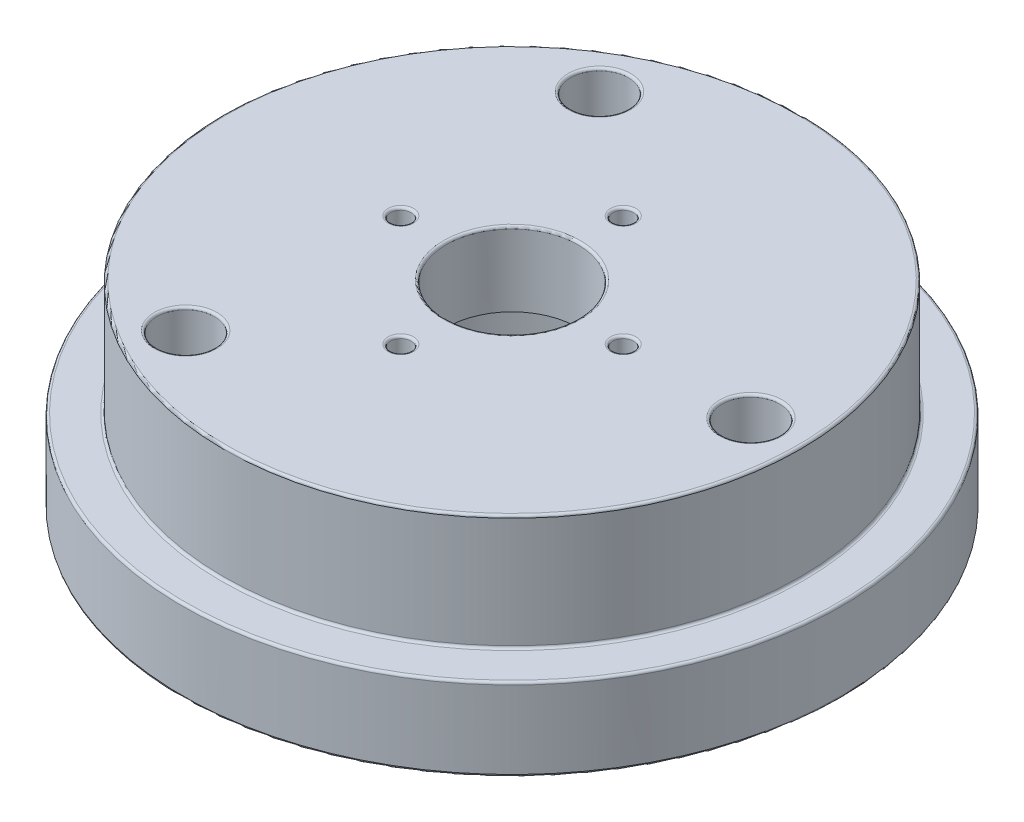
ISO-10303-21;
HEADER;
FILE_DESCRIPTION(('STEP AP214'),'2;1');
FILE_NAME('part.step','',(''),(''),'','','');
FILE_SCHEMA(('AUTOMOTIVE_DESIGN { 1 0 10303 214 1 1 1 1 }'));
ENDSEC;
DATA;
#1=APPLICATION_CONTEXT('core data for automotive mechanical design processes');
#2=APPLICATION_PROTOCOL_DEFINITION('international standard','automotive_design',2000,#1);
#3=PRODUCT_CONTEXT('',#1,'mechanical');
#4=PRODUCT('Part','Part','',(#3));
#5=PRODUCT_RELATED_PRODUCT_CATEGORY('part','',(#4));
#6=PRODUCT_DEFINITION_FORMATION('','',#4);
#7=PRODUCT_DEFINITION_CONTEXT('part definition',#1,'design');
#8=PRODUCT_DEFINITION('design','',#6,#7);
#9=PRODUCT_DEFINITION_SHAPE('','',#8);
#10=(LENGTH_UNIT() NAMED_UNIT(*) SI_UNIT(.MILLI.,.METRE.));
#11=(NAMED_UNIT(*) PLANE_ANGLE_UNIT() SI_UNIT($,.RADIAN.));
#12=(NAMED_UNIT(*) SI_UNIT($,.STERADIAN.) SOLID_ANGLE_UNIT());
#13=UNCERTAINTY_MEASURE_WITH_UNIT(LENGTH_MEASURE(1.E-05),#10,'distance_accuracy_value','');
#14=(GEOMETRIC_REPRESENTATION_CONTEXT(3) GLOBAL_UNCERTAINTY_ASSIGNED_CONTEXT((#13)) GLOBAL_UNIT_ASSIGNED_CONTEXT((#10,
#11,#12)) REPRESENTATION_CONTEXT('',''));
#15=CARTESIAN_POINT('',(0.,0.,0.));
#16=DIRECTION('',(0.,0.,1.));
#17=DIRECTION('',(1.,0.,0.));
#18=AXIS2_PLACEMENT_3D('',#15,#16,#17);
#19=CARTESIAN_POINT('',(-6.75,12.,0.));
#20=DIRECTION('',(0.,-1.,0.));
#21=DIRECTION('',(1.,0.,0.));
#22=AXIS2_PLACEMENT_3D('',#19,#20,#21);
#23=CYLINDRICAL_SURFACE('',#22,0.624999999999999);
#24=CARTESIAN_POINT('',(-6.75,11.85,0.));
#25=DIRECTION('',(0.,1.,0.));
#26=DIRECTION('',(-1.,0.,0.));
#27=AXIS2_PLACEMENT_3D('',#24,#25,#26);
#28=CIRCLE('',#27,0.624999999999999);
#29=CARTESIAN_POINT('',(-7.375,11.85,0.));
#30=VERTEX_POINT('',#29);
#31=EDGE_CURVE('E70',#30,#30,#28,.T.);
#32=ORIENTED_EDGE('',*,*,#31,.T.);
#33=EDGE_LOOP('',(#32));
#34=FACE_BOUND('',#33,.T.);
#35=CARTESIAN_POINT('',(-6.75,7.5,0.));
#36=DIRECTION('',(0.,-1.,0.));
#37=DIRECTION('',(1.,0.,0.));
#38=AXIS2_PLACEMENT_3D('',#35,#36,#37);
#39=CIRCLE('',#38,0.624999999999999);
#40=CARTESIAN_POINT('',(-6.125,7.5,0.));
#41=VERTEX_POINT('',#40);
#42=EDGE_CURVE('E154',#41,#41,#39,.T.);
#43=ORIENTED_EDGE('',*,*,#42,.T.);
#44=EDGE_LOOP('',(#43));
#45=FACE_BOUND('',#44,.T.);
#46=ADVANCED_FACE('F35',(#34,#45),#23,.F.);
#47=CARTESIAN_POINT('',(0.,12.,6.75));
#48=DIRECTION('',(0.,-1.,0.));
#49=DIRECTION('',(1.,0.,0.));
#50=AXIS2_PLACEMENT_3D('',#47,#48,#49);
#51=CYLINDRICAL_SURFACE('',#50,0.624999999999999);
#52=CARTESIAN_POINT('',(0.,11.85,6.75));
#53=DIRECTION('',(0.,1.,0.));
#54=DIRECTION('',(-1.,0.,0.));
#55=AXIS2_PLACEMENT_3D('',#52,#53,#54);
#56=CIRCLE('',#55,0.624999999999999);
#57=CARTESIAN_POINT('',(-0.624999999999929,11.85,6.75));
#58=VERTEX_POINT('',#57);
#59=EDGE_CURVE('E67',#58,#58,#56,.T.);
#60=ORIENTED_EDGE('',*,*,#59,.T.);
#61=EDGE_LOOP('',(#60));
#62=FACE_BOUND('',#61,.T.);
#63=CARTESIAN_POINT('',(0.,7.5,6.75));
#64=DIRECTION('',(0.,-1.,0.));
#65=DIRECTION('',(1.,0.,0.));
#66=AXIS2_PLACEMENT_3D('',#63,#64,#65);
#67=CIRCLE('',#66,0.624999999999999);
#68=CARTESIAN_POINT('',(0.62500000000007,7.5,6.75));
#69=VERTEX_POINT('',#68);
#70=EDGE_CURVE('E157',#69,#69,#67,.T.);
#71=ORIENTED_EDGE('',*,*,#70,.T.);
#72=EDGE_LOOP('',(#71));
#73=FACE_BOUND('',#72,.T.);
#74=ADVANCED_FACE('F161',(#62,#73),#51,.F.);
#75=CARTESIAN_POINT('',(0.,12.,0.));
#76=DIRECTION('',(0.,-1.,0.));
#77=DIRECTION('',(1.,0.,0.));
#78=AXIS2_PLACEMENT_3D('',#75,#76,#77);
#79=CYLINDRICAL_SURFACE('',#78,4.);
#80=CARTESIAN_POINT('',(0.,11.85,0.));
#81=DIRECTION('',(0.,1.,0.));
#82=DIRECTION('',(-1.,0.,0.));
#83=AXIS2_PLACEMENT_3D('',#80,#81,#82);
#84=CIRCLE('',#83,4.);
#85=CARTESIAN_POINT('',(-4.,11.85,0.));
#86=VERTEX_POINT('',#85);
#87=EDGE_CURVE('E61',#86,#86,#84,.T.);
#88=ORIENTED_EDGE('',*,*,#87,.T.);
#89=EDGE_LOOP('',(#88));
#90=FACE_BOUND('',#89,.T.);
#91=CARTESIAN_POINT('',(0.,7.5,0.));
#92=DIRECTION('',(0.,-1.,0.));
#93=DIRECTION('',(1.,0.,0.));
#94=AXIS2_PLACEMENT_3D('',#91,#92,#93);
#95=CIRCLE('',#94,4.);
#96=CARTESIAN_POINT('',(4.,7.5,0.));
#97=VERTEX_POINT('',#96);
#98=EDGE_CURVE('E145',#97,#97,#95,.T.);
#99=ORIENTED_EDGE('',*,*,#98,.T.);
#100=EDGE_LOOP('',(#99));
#101=FACE_BOUND('',#100,.T.);
#102=ADVANCED_FACE('F177',(#90,#101),#79,.F.);
#103=CARTESIAN_POINT('',(6.75,12.,0.));
#104=DIRECTION('',(0.,-1.,0.));
#105=DIRECTION('',(1.,0.,0.));
#106=AXIS2_PLACEMENT_3D('',#103,#104,#105);
#107=CYLINDRICAL_SURFACE('',#106,0.625);
#108=CARTESIAN_POINT('',(6.75,11.85,0.));
#109=DIRECTION('',(0.,1.,0.));
#110=DIRECTION('',(-1.,0.,0.));
#111=AXIS2_PLACEMENT_3D('',#108,#109,#110);
#112=CIRCLE('',#111,0.625);
#113=CARTESIAN_POINT('',(6.125,11.85,0.));
#114=VERTEX_POINT('',#113);
#115=EDGE_CURVE('E58',#114,#114,#112,.T.);
#116=ORIENTED_EDGE('',*,*,#115,.T.);
#117=EDGE_LOOP('',(#116));
#118=FACE_BOUND('',#117,.T.);
#119=CARTESIAN_POINT('',(6.75,7.5,0.));
#120=DIRECTION('',(0.,-1.,0.));
#121=DIRECTION('',(1.,0.,0.));
#122=AXIS2_PLACEMENT_3D('',#119,#120,#121);
#123=CIRCLE('',#122,0.625);
#124=CARTESIAN_POINT('',(7.375,7.5,0.));
#125=VERTEX_POINT('',#124);
#126=EDGE_CURVE('E148',#125,#125,#123,.T.);
#127=ORIENTED_EDGE('',*,*,#126,.T.);
#128=EDGE_LOOP('',(#127));
#129=FACE_BOUND('',#128,.T.);
#130=ADVANCED_FACE('F179',(#118,#129),#107,.F.);
#131=CARTESIAN_POINT('',(0.,12.,-6.75));
#132=DIRECTION('',(0.,-1.,0.));
#133=DIRECTION('',(1.,0.,0.));
#134=AXIS2_PLACEMENT_3D('',#131,#132,#133);
#135=CYLINDRICAL_SURFACE('',#134,0.625);
#136=CARTESIAN_POINT('',(0.,11.85,-6.75));
#137=DIRECTION('',(0.,1.,0.));
#138=DIRECTION('',(-1.,0.,0.));
#139=AXIS2_PLACEMENT_3D('',#136,#137,#138);
#140=CIRCLE('',#139,0.625);
#141=CARTESIAN_POINT('',(-0.625000000000023,11.85,-6.75));
#142=VERTEX_POINT('',#141);
#143=EDGE_CURVE('E55',#142,#142,#140,.T.);
#144=ORIENTED_EDGE('',*,*,#143,.T.);
#145=EDGE_LOOP('',(#144));
#146=FACE_BOUND('',#145,.T.);
#147=CARTESIAN_POINT('',(0.,7.5,-6.75));
#148=DIRECTION('',(0.,-1.,0.));
#149=DIRECTION('',(1.,0.,0.));
#150=AXIS2_PLACEMENT_3D('',#147,#148,#149);
#151=CIRCLE('',#150,0.625);
#152=CARTESIAN_POINT('',(0.624999999999976,7.5,-6.75));
#153=VERTEX_POINT('',#152);
#154=EDGE_CURVE('E151',#153,#153,#151,.T.);
#155=ORIENTED_EDGE('',*,*,#154,.T.);
#156=EDGE_LOOP('',(#155));
#157=FACE_BOUND('',#156,.T.);
#158=ADVANCED_FACE('F186',(#146,#157),#135,.F.);
#159=CARTESIAN_POINT('',(0.,0.,0.));
#160=DIRECTION('',(0.,-1.,0.));
#161=DIRECTION('',(1.,0.,0.));
#162=AXIS2_PLACEMENT_3D('',#159,#160,#161);
#163=PLANE('',#162);
#164=CARTESIAN_POINT('',(0.,0.,0.));
#165=DIRECTION('',(0.,-1.,0.));
#166=DIRECTION('',(1.,0.,0.));
#167=AXIS2_PLACEMENT_3D('',#164,#165,#166);
#168=CIRCLE('',#167,19.85);
#169=CARTESIAN_POINT('',(19.85,0.,0.));
#170=VERTEX_POINT('',#169);
#171=EDGE_CURVE('E109',#170,#170,#168,.T.);
#172=ORIENTED_EDGE('',*,*,#171,.T.);
#173=EDGE_LOOP('',(#172));
#174=FACE_BOUND('',#173,.T.);
#175=CARTESIAN_POINT('',(14.5,0.,0.));
#176=DIRECTION('',(0.,-1.,0.));
#177=DIRECTION('',(1.,0.,0.));
#178=AXIS2_PLACEMENT_3D('',#175,#176,#177);
#179=CIRCLE('',#178,1.9);
#180=CARTESIAN_POINT('',(16.4,0.,0.));
#181=VERTEX_POINT('',#180);
#182=EDGE_CURVE('E112',#181,#181,#179,.F.);
#183=ORIENTED_EDGE('',*,*,#182,.T.);
#184=EDGE_LOOP('',(#183));
#185=FACE_BOUND('',#184,.T.);
#186=CARTESIAN_POINT('',(-7.24999999999999,0.,-12.5573683548744));
#187=DIRECTION('',(0.,-1.,0.));
#188=DIRECTION('',(1.,0.,0.));
#189=AXIS2_PLACEMENT_3D('',#186,#187,#188);
#190=CIRCLE('',#189,1.89999999999998);
#191=CARTESIAN_POINT('',(-5.35000000000002,0.,-12.5573683548744));
#192=VERTEX_POINT('',#191);
#193=EDGE_CURVE('E115',#192,#192,#190,.F.);
#194=ORIENTED_EDGE('',*,*,#193,.T.);
#195=EDGE_LOOP('',(#194));
#196=FACE_BOUND('',#195,.T.);
#197=CARTESIAN_POINT('',(-7.25,0.,12.5573683548744));
#198=DIRECTION('',(0.,-1.,0.));
#199=DIRECTION('',(1.,0.,0.));
#200=AXIS2_PLACEMENT_3D('',#197,#198,#199);
#201=CIRCLE('',#200,1.89999999999996);
#202=CARTESIAN_POINT('',(-5.35000000000004,0.,12.5573683548744));
#203=VERTEX_POINT('',#202);
#204=EDGE_CURVE('E118',#203,#203,#201,.F.);
#205=ORIENTED_EDGE('',*,*,#204,.T.);
#206=EDGE_LOOP('',(#205));
#207=FACE_BOUND('',#206,.T.);
#208=CARTESIAN_POINT('',(0.,0.,0.));
#209=DIRECTION('',(0.,-1.,0.));
#210=DIRECTION('',(1.,0.,0.));
#211=AXIS2_PLACEMENT_3D('',#208,#209,#210);
#212=CIRCLE('',#211,10.15);
#213=CARTESIAN_POINT('',(10.15,0.,0.));
#214=VERTEX_POINT('',#213);
#215=EDGE_CURVE('E121',#214,#214,#212,.F.);
#216=ORIENTED_EDGE('',*,*,#215,.T.);
#217=EDGE_LOOP('',(#216));
#218=FACE_BOUND('',#217,.T.);
#219=ADVANCED_FACE('F216',(#174,#185,#196,#207,#218),#163,.T.);
#220=CARTESIAN_POINT('',(0.,12.,0.));
#221=DIRECTION('',(0.,1.,0.));
#222=DIRECTION('',(-1.,0.,0.));
#223=AXIS2_PLACEMENT_3D('',#220,#221,#222);
#224=CYLINDRICAL_SURFACE('',#223,20.);
#225=CARTESIAN_POINT('',(0.,4.85,0.));
#226=DIRECTION('',(0.,1.,0.));
#227=DIRECTION('',(-1.,0.,0.));
#228=AXIS2_PLACEMENT_3D('',#225,#226,#227);
#229=CIRCLE('',#228,20.);
#230=CARTESIAN_POINT('',(-20.,4.85,0.));
#231=VERTEX_POINT('',#230);
#232=EDGE_CURVE('E124',#231,#231,#229,.F.);
#233=ORIENTED_EDGE('',*,*,#232,.T.);
#234=EDGE_LOOP('',(#233));
#235=FACE_BOUND('',#234,.T.);
#236=CARTESIAN_POINT('',(0.,0.149999999999999,0.));
#237=DIRECTION('',(0.,-1.,0.));
#238=DIRECTION('',(1.,0.,0.));
#239=AXIS2_PLACEMENT_3D('',#236,#237,#238);
#240=CIRCLE('',#239,20.);
#241=CARTESIAN_POINT('',(20.,0.149999999999999,0.));
#242=VERTEX_POINT('',#241);
#243=EDGE_CURVE('E127',#242,#242,#240,.F.);
#244=ORIENTED_EDGE('',*,*,#243,.T.);
#245=EDGE_LOOP('',(#244));
#246=FACE_BOUND('',#245,.T.);
#247=ADVANCED_FACE('F212',(#235,#246),#224,.T.);
#248=CARTESIAN_POINT('',(-20.,5.,0.));
#249=DIRECTION('',(0.,1.,0.));
#250=DIRECTION('',(-1.,0.,0.));
#251=AXIS2_PLACEMENT_3D('',#248,#249,#250);
#252=PLANE('',#251);
#253=CARTESIAN_POINT('',(0.,5.,0.));
#254=DIRECTION('',(0.,1.,0.));
#255=DIRECTION('',(-1.,0.,0.));
#256=AXIS2_PLACEMENT_3D('',#253,#254,#255);
#257=CIRCLE('',#256,19.85);
#258=CARTESIAN_POINT('',(-19.85,5.,0.));
#259=VERTEX_POINT('',#258);
#260=EDGE_CURVE('E130',#259,#259,#257,.T.);
#261=ORIENTED_EDGE('',*,*,#260,.T.);
#262=EDGE_LOOP('',(#261));
#263=FACE_BOUND('',#262,.T.);
#264=CARTESIAN_POINT('',(0.,5.,0.));
#265=DIRECTION('',(0.,1.,0.));
#266=DIRECTION('',(-1.,0.,0.));
#267=AXIS2_PLACEMENT_3D('',#264,#265,#266);
#268=CIRCLE('',#267,17.65);
#269=CARTESIAN_POINT('',(-17.65,5.,0.));
#270=VERTEX_POINT('',#269);
#271=EDGE_CURVE('E133',#270,#270,#268,.F.);
#272=ORIENTED_EDGE('',*,*,#271,.T.);
#273=EDGE_LOOP('',(#272));
#274=FACE_BOUND('',#273,.T.);
#275=ADVANCED_FACE('F208',(#263,#274),#252,.T.);
#276=CARTESIAN_POINT('',(0.,12.,0.));
#277=DIRECTION('',(0.,1.,0.));
#278=DIRECTION('',(-1.,0.,0.));
#279=AXIS2_PLACEMENT_3D('',#276,#277,#278);
#280=CYLINDRICAL_SURFACE('',#279,17.5);
#281=CARTESIAN_POINT('',(0.,11.85,0.));
#282=DIRECTION('',(0.,1.,0.));
#283=DIRECTION('',(-1.,0.,0.));
#284=AXIS2_PLACEMENT_3D('',#281,#282,#283);
#285=CIRCLE('',#284,17.5);
#286=CARTESIAN_POINT('',(-17.5,11.85,0.));
#287=VERTEX_POINT('',#286);
#288=EDGE_CURVE('E136',#287,#287,#285,.F.);
#289=ORIENTED_EDGE('',*,*,#288,.T.);
#290=EDGE_LOOP('',(#289));
#291=FACE_BOUND('',#290,.T.);
#292=CARTESIAN_POINT('',(0.,5.15,0.));
#293=DIRECTION('',(0.,1.,0.));
#294=DIRECTION('',(-1.,0.,0.));
#295=AXIS2_PLACEMENT_3D('',#292,#293,#294);
#296=CIRCLE('',#295,17.5);
#297=CARTESIAN_POINT('',(-17.5,5.15,0.));
#298=VERTEX_POINT('',#297);
#299=EDGE_CURVE('E139',#298,#298,#296,.T.);
#300=ORIENTED_EDGE('',*,*,#299,.T.);
#301=EDGE_LOOP('',(#300));
#302=FACE_BOUND('',#301,.T.);
#303=ADVANCED_FACE('F204',(#291,#302),#280,.T.);
#304=CARTESIAN_POINT('',(-17.5,12.,0.));
#305=DIRECTION('',(0.,1.,0.));
#306=DIRECTION('',(-1.,0.,0.));
#307=AXIS2_PLACEMENT_3D('',#304,#305,#306);
#308=PLANE('',#307);
#309=CARTESIAN_POINT('',(-6.75,12.,0.));
#310=DIRECTION('',(0.,1.,0.));
#311=DIRECTION('',(-1.,0.,0.));
#312=AXIS2_PLACEMENT_3D('',#309,#310,#311);
#313=CIRCLE('',#312,0.774999999999999);
#314=CARTESIAN_POINT('',(-7.525,12.,0.));
#315=VERTEX_POINT('',#314);
#316=EDGE_CURVE('E73',#315,#315,#313,.F.);
#317=ORIENTED_EDGE('',*,*,#316,.T.);
#318=EDGE_LOOP('',(#317));
#319=FACE_BOUND('',#318,.T.);
#320=CARTESIAN_POINT('',(0.,12.,6.75));
#321=DIRECTION('',(0.,1.,0.));
#322=DIRECTION('',(-1.,0.,0.));
#323=AXIS2_PLACEMENT_3D('',#320,#321,#322);
#324=CIRCLE('',#323,0.774999999999999);
#325=CARTESIAN_POINT('',(-0.774999999999929,12.,6.75));
#326=VERTEX_POINT('',#325);
#327=EDGE_CURVE('E76',#326,#326,#324,.F.);
#328=ORIENTED_EDGE('',*,*,#327,.T.);
#329=EDGE_LOOP('',(#328));
#330=FACE_BOUND('',#329,.T.);
#331=CARTESIAN_POINT('',(14.5,12.,0.));
#332=DIRECTION('',(0.,1.,0.));
#333=DIRECTION('',(-1.,0.,0.));
#334=AXIS2_PLACEMENT_3D('',#331,#332,#333);
#335=CIRCLE('',#334,1.9);
#336=CARTESIAN_POINT('',(12.6,12.,0.));
#337=VERTEX_POINT('',#336);
#338=EDGE_CURVE('E79',#337,#337,#335,.F.);
#339=ORIENTED_EDGE('',*,*,#338,.T.);
#340=EDGE_LOOP('',(#339));
#341=FACE_BOUND('',#340,.T.);
#342=CARTESIAN_POINT('',(0.,12.,0.));
#343=DIRECTION('',(0.,1.,0.));
#344=DIRECTION('',(-1.,0.,0.));
#345=AXIS2_PLACEMENT_3D('',#342,#343,#344);
#346=CIRCLE('',#345,4.15);
#347=CARTESIAN_POINT('',(-4.15,12.,0.));
#348=VERTEX_POINT('',#347);
#349=EDGE_CURVE('E82',#348,#348,#346,.F.);
#350=ORIENTED_EDGE('',*,*,#349,.T.);
#351=EDGE_LOOP('',(#350));
#352=FACE_BOUND('',#351,.T.);
#353=CARTESIAN_POINT('',(6.75,12.,0.));
#354=DIRECTION('',(0.,1.,0.));
#355=DIRECTION('',(-1.,0.,0.));
#356=AXIS2_PLACEMENT_3D('',#353,#354,#355);
#357=CIRCLE('',#356,0.775);
#358=CARTESIAN_POINT('',(5.975,12.,0.));
#359=VERTEX_POINT('',#358);
#360=EDGE_CURVE('E85',#359,#359,#357,.F.);
#361=ORIENTED_EDGE('',*,*,#360,.T.);
#362=EDGE_LOOP('',(#361));
#363=FACE_BOUND('',#362,.T.);
#364=CARTESIAN_POINT('',(0.,12.,-6.75));
#365=DIRECTION('',(0.,1.,0.));
#366=DIRECTION('',(-1.,0.,0.));
#367=AXIS2_PLACEMENT_3D('',#364,#365,#366);
#368=CIRCLE('',#367,0.775);
#369=CARTESIAN_POINT('',(-0.775000000000023,12.,-6.75));
#370=VERTEX_POINT('',#369);
#371=EDGE_CURVE('E88',#370,#370,#368,.F.);
#372=ORIENTED_EDGE('',*,*,#371,.T.);
#373=EDGE_LOOP('',(#372));
#374=FACE_BOUND('',#373,.T.);
#375=CARTESIAN_POINT('',(-7.24999999999999,12.,-12.5573683548744));
#376=DIRECTION('',(0.,1.,0.));
#377=DIRECTION('',(-1.,0.,0.));
#378=AXIS2_PLACEMENT_3D('',#375,#376,#377);
#379=CIRCLE('',#378,1.89999999999998);
#380=CARTESIAN_POINT('',(-9.14999999999997,12.,-12.5573683548744));
#381=VERTEX_POINT('',#380);
#382=EDGE_CURVE('E91',#381,#381,#379,.F.);
#383=ORIENTED_EDGE('',*,*,#382,.T.);
#384=EDGE_LOOP('',(#383));
#385=FACE_BOUND('',#384,.T.);
#386=CARTESIAN_POINT('',(-7.25,12.,12.5573683548744));
#387=DIRECTION('',(0.,1.,0.));
#388=DIRECTION('',(-1.,0.,0.));
#389=AXIS2_PLACEMENT_3D('',#386,#387,#388);
#390=CIRCLE('',#389,1.89999999999996);
#391=CARTESIAN_POINT('',(-9.14999999999996,12.,12.5573683548744));
#392=VERTEX_POINT('',#391);
#393=EDGE_CURVE('E94',#392,#392,#390,.F.);
#394=ORIENTED_EDGE('',*,*,#393,.T.);
#395=EDGE_LOOP('',(#394));
#396=FACE_BOUND('',#395,.T.);
#397=CARTESIAN_POINT('',(0.,12.,0.));
#398=DIRECTION('',(0.,1.,0.));
#399=DIRECTION('',(-1.,0.,0.));
#400=AXIS2_PLACEMENT_3D('',#397,#398,#399);
#401=CIRCLE('',#400,17.35);
#402=CARTESIAN_POINT('',(-17.35,12.,0.));
#403=VERTEX_POINT('',#402);
#404=EDGE_CURVE('E142',#403,#403,#401,.T.);
#405=ORIENTED_EDGE('',*,*,#404,.T.);
#406=EDGE_LOOP('',(#405));
#407=FACE_BOUND('',#406,.T.);
#408=ADVANCED_FACE('F200',(#319,#330,#341,#352,#363,#374,#385,#396,#407),#308,.T.);
#409=CARTESIAN_POINT('',(14.5,12.,0.));
#410=DIRECTION('',(0.,-1.,0.));
#411=DIRECTION('',(1.,0.,0.));
#412=AXIS2_PLACEMENT_3D('',#409,#410,#411);
#413=CYLINDRICAL_SURFACE('',#412,1.75);
#414=CARTESIAN_POINT('',(14.5,11.85,0.));
#415=DIRECTION('',(0.,1.,0.));
#416=DIRECTION('',(-1.,0.,0.));
#417=AXIS2_PLACEMENT_3D('',#414,#415,#416);
#418=CIRCLE('',#417,1.75);
#419=CARTESIAN_POINT('',(12.75,11.85,0.));
#420=VERTEX_POINT('',#419);
#421=EDGE_CURVE('E64',#420,#420,#418,.T.);
#422=ORIENTED_EDGE('',*,*,#421,.T.);
#423=EDGE_LOOP('',(#422));
#424=FACE_BOUND('',#423,.T.);
#425=CARTESIAN_POINT('',(14.5,0.149999999999999,0.));
#426=DIRECTION('',(0.,-1.,0.));
#427=DIRECTION('',(1.,0.,0.));
#428=AXIS2_PLACEMENT_3D('',#425,#426,#427);
#429=CIRCLE('',#428,1.75);
#430=CARTESIAN_POINT('',(16.25,0.149999999999999,0.));
#431=VERTEX_POINT('',#430);
#432=EDGE_CURVE('E106',#431,#431,#429,.T.);
#433=ORIENTED_EDGE('',*,*,#432,.T.);
#434=EDGE_LOOP('',(#433));
#435=FACE_BOUND('',#434,.T.);
#436=ADVANCED_FACE('F203',(#424,#435),#413,.F.);
#437=CARTESIAN_POINT('',(-7.24999999999999,12.,-12.5573683548744));
#438=DIRECTION('',(0.,-1.,0.));
#439=DIRECTION('',(1.,0.,0.));
#440=AXIS2_PLACEMENT_3D('',#437,#438,#439);
#441=CYLINDRICAL_SURFACE('',#440,1.74999999999998);
#442=CARTESIAN_POINT('',(-7.24999999999999,11.85,-12.5573683548744));
#443=DIRECTION('',(0.,1.,0.));
#444=DIRECTION('',(-1.,0.,0.));
#445=AXIS2_PLACEMENT_3D('',#442,#443,#444);
#446=CIRCLE('',#445,1.74999999999998);
#447=CARTESIAN_POINT('',(-8.99999999999997,11.85,-12.5573683548744));
#448=VERTEX_POINT('',#447);
#449=EDGE_CURVE('E50',#448,#448,#446,.T.);
#450=ORIENTED_EDGE('',*,*,#449,.T.);
#451=EDGE_LOOP('',(#450));
#452=FACE_BOUND('',#451,.T.);
#453=CARTESIAN_POINT('',(-7.24999999999999,0.149999999999999,-12.5573683548744));
#454=DIRECTION('',(0.,-1.,0.));
#455=DIRECTION('',(1.,0.,0.));
#456=AXIS2_PLACEMENT_3D('',#453,#454,#455);
#457=CIRCLE('',#456,1.74999999999998);
#458=CARTESIAN_POINT('',(-5.50000000000002,0.149999999999999,-12.5573683548744));
#459=VERTEX_POINT('',#458);
#460=EDGE_CURVE('E103',#459,#459,#457,.T.);
#461=ORIENTED_EDGE('',*,*,#460,.T.);
#462=EDGE_LOOP('',(#461));
#463=FACE_BOUND('',#462,.T.);
#464=ADVANCED_FACE('F297',(#452,#463),#441,.F.);
#465=CARTESIAN_POINT('',(-7.25,12.,12.5573683548744));
#466=DIRECTION('',(0.,-1.,0.));
#467=DIRECTION('',(1.,0.,0.));
#468=AXIS2_PLACEMENT_3D('',#465,#466,#467);
#469=CYLINDRICAL_SURFACE('',#468,1.74999999999996);
#470=CARTESIAN_POINT('',(-7.25,11.85,12.5573683548744));
#471=DIRECTION('',(0.,1.,0.));
#472=DIRECTION('',(-1.,0.,0.));
#473=AXIS2_PLACEMENT_3D('',#470,#471,#472);
#474=CIRCLE('',#473,1.74999999999996);
#475=CARTESIAN_POINT('',(-8.99999999999996,11.85,12.5573683548744));
#476=VERTEX_POINT('',#475);
#477=EDGE_CURVE('E46',#476,#476,#474,.T.);
#478=ORIENTED_EDGE('',*,*,#477,.T.);
#479=EDGE_LOOP('',(#478));
#480=FACE_BOUND('',#479,.T.);
#481=CARTESIAN_POINT('',(-7.25,0.149999999999999,12.5573683548744));
#482=DIRECTION('',(0.,-1.,0.));
#483=DIRECTION('',(1.,0.,0.));
#484=AXIS2_PLACEMENT_3D('',#481,#482,#483);
#485=CIRCLE('',#484,1.74999999999996);
#486=CARTESIAN_POINT('',(-5.50000000000004,0.149999999999999,12.5573683548744));
#487=VERTEX_POINT('',#486);
#488=EDGE_CURVE('E100',#487,#487,#485,.T.);
#489=ORIENTED_EDGE('',*,*,#488,.T.);
#490=EDGE_LOOP('',(#489));
#491=FACE_BOUND('',#490,.T.);
#492=ADVANCED_FACE('F294',(#480,#491),#469,.F.);
#493=CARTESIAN_POINT('',(0.,7.5,0.));
#494=DIRECTION('',(0.,-1.,0.));
#495=DIRECTION('',(1.,0.,0.));
#496=AXIS2_PLACEMENT_3D('',#493,#494,#495);
#497=CYLINDRICAL_SURFACE('',#496,10.);
#498=CARTESIAN_POINT('',(0.,7.35,0.));
#499=DIRECTION('',(0.,-1.,0.));
#500=DIRECTION('',(1.,0.,0.));
#501=AXIS2_PLACEMENT_3D('',#498,#499,#500);
#502=CIRCLE('',#501,10.);
#503=CARTESIAN_POINT('',(10.,7.35,0.));
#504=VERTEX_POINT('',#503);
#505=EDGE_CURVE('E10',#504,#504,#502,.F.);
#506=ORIENTED_EDGE('',*,*,#505,.T.);
#507=EDGE_LOOP('',(#506));
#508=FACE_BOUND('',#507,.T.);
#509=CARTESIAN_POINT('',(0.,0.15,0.));
#510=DIRECTION('',(0.,-1.,0.));
#511=DIRECTION('',(1.,0.,0.));
#512=AXIS2_PLACEMENT_3D('',#509,#510,#511);
#513=CIRCLE('',#512,10.);
#514=CARTESIAN_POINT('',(10.,0.15,0.));
#515=VERTEX_POINT('',#514);
#516=EDGE_CURVE('E97',#515,#515,#513,.T.);
#517=ORIENTED_EDGE('',*,*,#516,.T.);
#518=EDGE_LOOP('',(#517));
#519=FACE_BOUND('',#518,.T.);
#520=ADVANCED_FACE('F167',(#508,#519),#497,.F.);
#521=CARTESIAN_POINT('',(0.,7.5,0.));
#522=DIRECTION('',(0.,-1.,0.));
#523=DIRECTION('',(1.,0.,0.));
#524=AXIS2_PLACEMENT_3D('',#521,#522,#523);
#525=PLANE('',#524);
#526=CARTESIAN_POINT('',(0.,7.5,0.));
#527=DIRECTION('',(0.,-1.,0.));
#528=DIRECTION('',(1.,0.,0.));
#529=AXIS2_PLACEMENT_3D('',#526,#527,#528);
#530=CIRCLE('',#529,9.85);
#531=CARTESIAN_POINT('',(9.85,7.5,0.));
#532=VERTEX_POINT('',#531);
#533=EDGE_CURVE('E42',#532,#532,#530,.T.);
#534=ORIENTED_EDGE('',*,*,#533,.T.);
#535=EDGE_LOOP('',(#534));
#536=FACE_BOUND('',#535,.T.);
#537=ORIENTED_EDGE('',*,*,#70,.F.);
#538=EDGE_LOOP('',(#537));
#539=FACE_BOUND('',#538,.T.);
#540=ORIENTED_EDGE('',*,*,#42,.F.);
#541=EDGE_LOOP('',(#540));
#542=FACE_BOUND('',#541,.T.);
#543=ORIENTED_EDGE('',*,*,#154,.F.);
#544=EDGE_LOOP('',(#543));
#545=FACE_BOUND('',#544,.T.);
#546=ORIENTED_EDGE('',*,*,#126,.F.);
#547=EDGE_LOOP('',(#546));
#548=FACE_BOUND('',#547,.T.);
#549=ORIENTED_EDGE('',*,*,#98,.F.);
#550=EDGE_LOOP('',(#549));
#551=FACE_BOUND('',#550,.T.);
#552=ADVANCED_FACE('F163',(#536,#539,#542,#545,#548,#551),#525,.T.);
#553=CARTESIAN_POINT('',(0.,11.85,0.));
#554=DIRECTION('',(0.,1.,0.));
#555=DIRECTION('',(-1.,0.,0.));
#556=AXIS2_PLACEMENT_3D('',#553,#554,#555);
#557=TOROIDAL_SURFACE('',#556,17.35,0.15);
#558=ORIENTED_EDGE('',*,*,#288,.F.);
#559=EDGE_LOOP('',(#558));
#560=FACE_BOUND('',#559,.T.);
#561=ORIENTED_EDGE('',*,*,#404,.F.);
#562=EDGE_LOOP('',(#561));
#563=FACE_BOUND('',#562,.T.);
#564=ADVANCED_FACE('F166',(#560,#563),#557,.T.);
#565=CARTESIAN_POINT('',(0.,4.85,0.));
#566=DIRECTION('',(0.,1.,0.));
#567=DIRECTION('',(-1.,0.,0.));
#568=AXIS2_PLACEMENT_3D('',#565,#566,#567);
#569=TOROIDAL_SURFACE('',#568,19.85,0.15);
#570=ORIENTED_EDGE('',*,*,#232,.F.);
#571=EDGE_LOOP('',(#570));
#572=FACE_BOUND('',#571,.T.);
#573=ORIENTED_EDGE('',*,*,#260,.F.);
#574=EDGE_LOOP('',(#573));
#575=FACE_BOUND('',#574,.T.);
#576=ADVANCED_FACE('F223',(#572,#575),#569,.T.);
#577=CARTESIAN_POINT('',(0.,5.15,0.));
#578=DIRECTION('',(0.,1.,0.));
#579=DIRECTION('',(-1.,0.,0.));
#580=AXIS2_PLACEMENT_3D('',#577,#578,#579);
#581=TOROIDAL_SURFACE('',#580,17.65,0.15);
#582=ORIENTED_EDGE('',*,*,#271,.F.);
#583=EDGE_LOOP('',(#582));
#584=FACE_BOUND('',#583,.T.);
#585=ORIENTED_EDGE('',*,*,#299,.F.);
#586=EDGE_LOOP('',(#585));
#587=FACE_BOUND('',#586,.T.);
#588=ADVANCED_FACE('F227',(#584,#587),#581,.F.);
#589=CARTESIAN_POINT('',(0.,0.149999999999999,0.));
#590=DIRECTION('',(0.,-1.,0.));
#591=DIRECTION('',(1.,0.,0.));
#592=AXIS2_PLACEMENT_3D('',#589,#590,#591);
#593=TOROIDAL_SURFACE('',#592,19.85,0.15);
#594=ORIENTED_EDGE('',*,*,#171,.F.);
#595=EDGE_LOOP('',(#594));
#596=FACE_BOUND('',#595,.T.);
#597=ORIENTED_EDGE('',*,*,#243,.F.);
#598=EDGE_LOOP('',(#597));
#599=FACE_BOUND('',#598,.T.);
#600=ADVANCED_FACE('F231',(#596,#599),#593,.T.);
#601=CARTESIAN_POINT('',(14.5,0.149999999999999,0.));
#602=DIRECTION('',(0.,-1.,0.));
#603=DIRECTION('',(1.,0.,0.));
#604=AXIS2_PLACEMENT_3D('',#601,#602,#603);
#605=TOROIDAL_SURFACE('',#604,1.9,0.15);
#606=ORIENTED_EDGE('',*,*,#182,.F.);
#607=EDGE_LOOP('',(#606));
#608=FACE_BOUND('',#607,.T.);
#609=ORIENTED_EDGE('',*,*,#432,.F.);
#610=EDGE_LOOP('',(#609));
#611=FACE_BOUND('',#610,.T.);
#612=ADVANCED_FACE('F235',(#608,#611),#605,.T.);
#613=CARTESIAN_POINT('',(-7.24999999999999,0.149999999999999,-12.5573683548744));
#614=DIRECTION('',(0.,-1.,0.));
#615=DIRECTION('',(1.,0.,0.));
#616=AXIS2_PLACEMENT_3D('',#613,#614,#615);
#617=TOROIDAL_SURFACE('',#616,1.89999999999998,0.15);
#618=ORIENTED_EDGE('',*,*,#193,.F.);
#619=EDGE_LOOP('',(#618));
#620=FACE_BOUND('',#619,.T.);
#621=ORIENTED_EDGE('',*,*,#460,.F.);
#622=EDGE_LOOP('',(#621));
#623=FACE_BOUND('',#622,.T.);
#624=ADVANCED_FACE('F239',(#620,#623),#617,.T.);
#625=CARTESIAN_POINT('',(-7.25,0.149999999999999,12.5573683548744));
#626=DIRECTION('',(0.,-1.,0.));
#627=DIRECTION('',(1.,0.,0.));
#628=AXIS2_PLACEMENT_3D('',#625,#626,#627);
#629=TOROIDAL_SURFACE('',#628,1.89999999999996,0.15);
#630=ORIENTED_EDGE('',*,*,#204,.F.);
#631=EDGE_LOOP('',(#630));
#632=FACE_BOUND('',#631,.T.);
#633=ORIENTED_EDGE('',*,*,#488,.F.);
#634=EDGE_LOOP('',(#633));
#635=FACE_BOUND('',#634,.T.);
#636=ADVANCED_FACE('F243',(#632,#635),#629,.T.);
#637=CARTESIAN_POINT('',(0.,0.15,0.));
#638=DIRECTION('',(0.,-1.,0.));
#639=DIRECTION('',(1.,0.,0.));
#640=AXIS2_PLACEMENT_3D('',#637,#638,#639);
#641=TOROIDAL_SURFACE('',#640,10.15,0.15);
#642=ORIENTED_EDGE('',*,*,#215,.F.);
#643=EDGE_LOOP('',(#642));
#644=FACE_BOUND('',#643,.T.);
#645=ORIENTED_EDGE('',*,*,#516,.F.);
#646=EDGE_LOOP('',(#645));
#647=FACE_BOUND('',#646,.T.);
#648=ADVANCED_FACE('F247',(#644,#647),#641,.T.);
#649=CARTESIAN_POINT('',(-6.75,11.85,0.));
#650=DIRECTION('',(0.,1.,0.));
#651=DIRECTION('',(-1.,0.,0.));
#652=AXIS2_PLACEMENT_3D('',#649,#650,#651);
#653=TOROIDAL_SURFACE('',#652,0.774999999999999,0.15);
#654=ORIENTED_EDGE('',*,*,#31,.F.);
#655=EDGE_LOOP('',(#654));
#656=FACE_BOUND('',#655,.T.);
#657=ORIENTED_EDGE('',*,*,#316,.F.);
#658=EDGE_LOOP('',(#657));
#659=FACE_BOUND('',#658,.T.);
#660=ADVANCED_FACE('F251',(#656,#659),#653,.T.);
#661=CARTESIAN_POINT('',(0.,11.85,6.75));
#662=DIRECTION('',(0.,1.,0.));
#663=DIRECTION('',(-1.,0.,0.));
#664=AXIS2_PLACEMENT_3D('',#661,#662,#663);
#665=TOROIDAL_SURFACE('',#664,0.774999999999999,0.15);
#666=ORIENTED_EDGE('',*,*,#59,.F.);
#667=EDGE_LOOP('',(#666));
#668=FACE_BOUND('',#667,.T.);
#669=ORIENTED_EDGE('',*,*,#327,.F.);
#670=EDGE_LOOP('',(#669));
#671=FACE_BOUND('',#670,.T.);
#672=ADVANCED_FACE('F255',(#668,#671),#665,.T.);
#673=CARTESIAN_POINT('',(14.5,11.85,0.));
#674=DIRECTION('',(0.,1.,0.));
#675=DIRECTION('',(-1.,0.,0.));
#676=AXIS2_PLACEMENT_3D('',#673,#674,#675);
#677=TOROIDAL_SURFACE('',#676,1.9,0.15);
#678=ORIENTED_EDGE('',*,*,#421,.F.);
#679=EDGE_LOOP('',(#678));
#680=FACE_BOUND('',#679,.T.);
#681=ORIENTED_EDGE('',*,*,#338,.F.);
#682=EDGE_LOOP('',(#681));
#683=FACE_BOUND('',#682,.T.);
#684=ADVANCED_FACE('F259',(#680,#683),#677,.T.);
#685=CARTESIAN_POINT('',(0.,11.85,0.));
#686=DIRECTION('',(0.,1.,0.));
#687=DIRECTION('',(-1.,0.,0.));
#688=AXIS2_PLACEMENT_3D('',#685,#686,#687);
#689=TOROIDAL_SURFACE('',#688,4.15,0.15);
#690=ORIENTED_EDGE('',*,*,#87,.F.);
#691=EDGE_LOOP('',(#690));
#692=FACE_BOUND('',#691,.T.);
#693=ORIENTED_EDGE('',*,*,#349,.F.);
#694=EDGE_LOOP('',(#693));
#695=FACE_BOUND('',#694,.T.);
#696=ADVANCED_FACE('F263',(#692,#695),#689,.T.);
#697=CARTESIAN_POINT('',(6.75,11.85,0.));
#698=DIRECTION('',(0.,1.,0.));
#699=DIRECTION('',(-1.,0.,0.));
#700=AXIS2_PLACEMENT_3D('',#697,#698,#699);
#701=TOROIDAL_SURFACE('',#700,0.775,0.15);
#702=ORIENTED_EDGE('',*,*,#115,.F.);
#703=EDGE_LOOP('',(#702));
#704=FACE_BOUND('',#703,.T.);
#705=ORIENTED_EDGE('',*,*,#360,.F.);
#706=EDGE_LOOP('',(#705));
#707=FACE_BOUND('',#706,.T.);
#708=ADVANCED_FACE('F267',(#704,#707),#701,.T.);
#709=CARTESIAN_POINT('',(0.,11.85,-6.75));
#710=DIRECTION('',(0.,1.,0.));
#711=DIRECTION('',(-1.,0.,0.));
#712=AXIS2_PLACEMENT_3D('',#709,#710,#711);
#713=TOROIDAL_SURFACE('',#712,0.775,0.15);
#714=ORIENTED_EDGE('',*,*,#143,.F.);
#715=EDGE_LOOP('',(#714));
#716=FACE_BOUND('',#715,.T.);
#717=ORIENTED_EDGE('',*,*,#371,.F.);
#718=EDGE_LOOP('',(#717));
#719=FACE_BOUND('',#718,.T.);
#720=ADVANCED_FACE('F271',(#716,#719),#713,.T.);
#721=CARTESIAN_POINT('',(-7.24999999999999,11.85,-12.5573683548744));
#722=DIRECTION('',(0.,1.,0.));
#723=DIRECTION('',(-1.,0.,0.));
#724=AXIS2_PLACEMENT_3D('',#721,#722,#723);
#725=TOROIDAL_SURFACE('',#724,1.89999999999998,0.15);
#726=ORIENTED_EDGE('',*,*,#449,.F.);
#727=EDGE_LOOP('',(#726));
#728=FACE_BOUND('',#727,.T.);
#729=ORIENTED_EDGE('',*,*,#382,.F.);
#730=EDGE_LOOP('',(#729));
#731=FACE_BOUND('',#730,.T.);
#732=ADVANCED_FACE('F275',(#728,#731),#725,.T.);
#733=CARTESIAN_POINT('',(-7.25,11.85,12.5573683548744));
#734=DIRECTION('',(0.,1.,0.));
#735=DIRECTION('',(-1.,0.,0.));
#736=AXIS2_PLACEMENT_3D('',#733,#734,#735);
#737=TOROIDAL_SURFACE('',#736,1.89999999999996,0.15);
#738=ORIENTED_EDGE('',*,*,#477,.F.);
#739=EDGE_LOOP('',(#738));
#740=FACE_BOUND('',#739,.T.);
#741=ORIENTED_EDGE('',*,*,#393,.F.);
#742=EDGE_LOOP('',(#741));
#743=FACE_BOUND('',#742,.T.);
#744=ADVANCED_FACE('F278',(#740,#743),#737,.T.);
#745=CARTESIAN_POINT('',(0.,7.35,0.));
#746=DIRECTION('',(0.,-1.,0.));
#747=DIRECTION('',(1.,0.,0.));
#748=AXIS2_PLACEMENT_3D('',#745,#746,#747);
#749=TOROIDAL_SURFACE('',#748,9.85,0.15);
#750=ORIENTED_EDGE('',*,*,#505,.F.);
#751=EDGE_LOOP('',(#750));
#752=FACE_BOUND('',#751,.T.);
#753=ORIENTED_EDGE('',*,*,#533,.F.);
#754=EDGE_LOOP('',(#753));
#755=FACE_BOUND('',#754,.T.);
#756=ADVANCED_FACE('F37',(#752,#755),#749,.F.);
#757=CLOSED_SHELL('',(#46,#74,#102,#130,#158,#219,#247,#275,#303,#408,#436,#464,#492,#520,#552,
#564,#576,#588,#600,#612,#624,#636,#648,#660,#672,#684,#696,#708,#720,#732,#744,#756));
#758=MANIFOLD_SOLID_BREP('B2',#757);
#759=ADVANCED_BREP_SHAPE_REPRESENTATION('',(#18,#758),#14);
#760=SHAPE_DEFINITION_REPRESENTATION(#9,#759);
ENDSEC;
END-ISO-10303-21;
